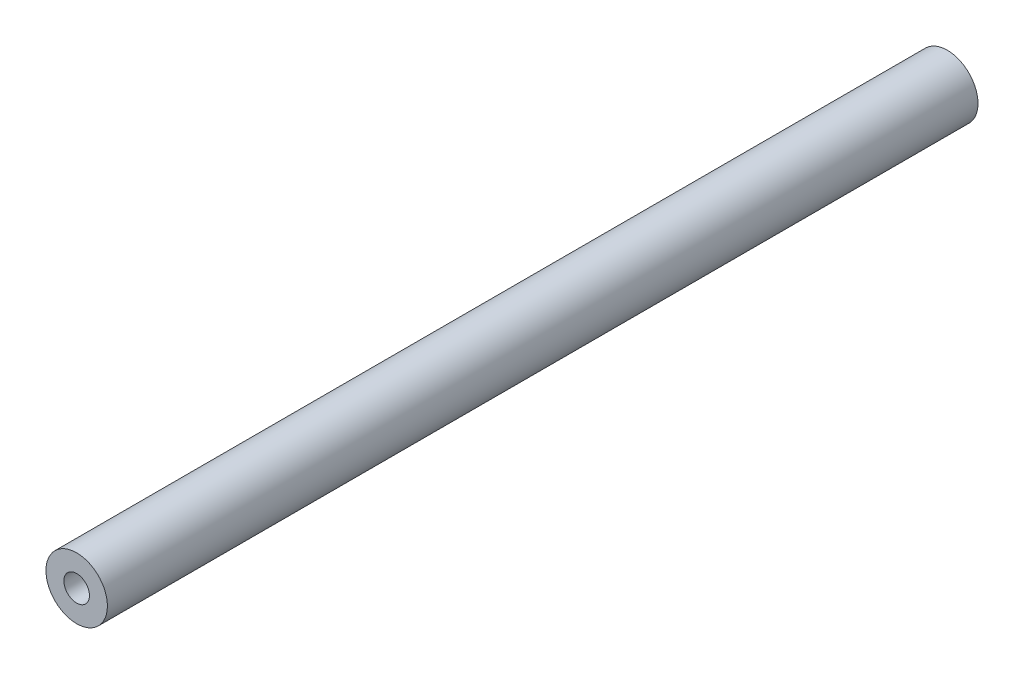
ISO-10303-21;
HEADER;
FILE_DESCRIPTION(('STEP AP214'),'2;1');
FILE_NAME('part.step','',(''),(''),'','','');
FILE_SCHEMA(('AUTOMOTIVE_DESIGN { 1 0 10303 214 1 1 1 1 }'));
ENDSEC;
DATA;
#1=APPLICATION_CONTEXT('core data for automotive mechanical design processes');
#2=APPLICATION_PROTOCOL_DEFINITION('international standard','automotive_design',2000,#1);
#3=PRODUCT_CONTEXT('',#1,'mechanical');
#4=PRODUCT('Part','Part','',(#3));
#5=PRODUCT_RELATED_PRODUCT_CATEGORY('part','',(#4));
#6=PRODUCT_DEFINITION_FORMATION('','',#4);
#7=PRODUCT_DEFINITION_CONTEXT('part definition',#1,'design');
#8=PRODUCT_DEFINITION('design','',#6,#7);
#9=PRODUCT_DEFINITION_SHAPE('','',#8);
#10=(LENGTH_UNIT() NAMED_UNIT(*) SI_UNIT(.MILLI.,.METRE.));
#11=(NAMED_UNIT(*) PLANE_ANGLE_UNIT() SI_UNIT($,.RADIAN.));
#12=(NAMED_UNIT(*) SI_UNIT($,.STERADIAN.) SOLID_ANGLE_UNIT());
#13=UNCERTAINTY_MEASURE_WITH_UNIT(LENGTH_MEASURE(1.E-05),#10,'distance_accuracy_value','');
#14=(GEOMETRIC_REPRESENTATION_CONTEXT(3) GLOBAL_UNCERTAINTY_ASSIGNED_CONTEXT((#13)) GLOBAL_UNIT_ASSIGNED_CONTEXT((#10,
#11,#12)) REPRESENTATION_CONTEXT('',''));
#15=CARTESIAN_POINT('',(0.,0.,0.));
#16=DIRECTION('',(0.,0.,1.));
#17=DIRECTION('',(1.,0.,0.));
#18=AXIS2_PLACEMENT_3D('',#15,#16,#17);
#19=CARTESIAN_POINT('',(0.,0.,85.));
#20=DIRECTION('',(0.,0.,-1.));
#21=DIRECTION('',(-1.,0.,0.));
#22=AXIS2_PLACEMENT_3D('',#19,#20,#21);
#23=CYLINDRICAL_SURFACE('',#22,3.);
#24=CARTESIAN_POINT('',(0.,0.,85.));
#25=DIRECTION('',(0.,0.,1.));
#26=DIRECTION('',(1.,0.,0.));
#27=AXIS2_PLACEMENT_3D('',#24,#25,#26);
#28=CIRCLE('',#27,3.);
#29=CARTESIAN_POINT('',(3.,0.,85.));
#30=VERTEX_POINT('',#29);
#31=EDGE_CURVE('E11',#30,#30,#28,.T.);
#32=ORIENTED_EDGE('',*,*,#31,.F.);
#33=EDGE_LOOP('',(#32));
#34=FACE_BOUND('',#33,.T.);
#35=CARTESIAN_POINT('',(0.,0.,0.));
#36=DIRECTION('',(0.,0.,1.));
#37=DIRECTION('',(1.,0.,0.));
#38=AXIS2_PLACEMENT_3D('',#35,#36,#37);
#39=CIRCLE('',#38,3.);
#40=CARTESIAN_POINT('',(3.,0.,0.));
#41=VERTEX_POINT('',#40);
#42=EDGE_CURVE('E41',#41,#41,#39,.T.);
#43=ORIENTED_EDGE('',*,*,#42,.T.);
#44=EDGE_LOOP('',(#43));
#45=FACE_BOUND('',#44,.T.);
#46=ADVANCED_FACE('F38',(#34,#45),#23,.T.);
#47=CARTESIAN_POINT('',(0.,0.,85.));
#48=DIRECTION('',(0.,0.,1.));
#49=DIRECTION('',(1.,0.,0.));
#50=AXIS2_PLACEMENT_3D('',#47,#48,#49);
#51=PLANE('',#50);
#52=CARTESIAN_POINT('',(0.,0.,85.));
#53=DIRECTION('',(0.,0.,1.));
#54=DIRECTION('',(1.,0.,0.));
#55=AXIS2_PLACEMENT_3D('',#52,#53,#54);
#56=CIRCLE('',#55,1.25);
#57=CARTESIAN_POINT('',(1.25,0.,85.));
#58=VERTEX_POINT('',#57);
#59=EDGE_CURVE('E63',#58,#58,#56,.T.);
#60=ORIENTED_EDGE('',*,*,#59,.F.);
#61=EDGE_LOOP('',(#60));
#62=FACE_BOUND('',#61,.T.);
#63=ORIENTED_EDGE('',*,*,#31,.T.);
#64=EDGE_LOOP('',(#63));
#65=FACE_BOUND('',#64,.T.);
#66=ADVANCED_FACE('F86',(#62,#65),#51,.T.);
#67=CARTESIAN_POINT('',(0.,0.,0.));
#68=DIRECTION('',(0.,0.,1.));
#69=DIRECTION('',(1.,0.,0.));
#70=AXIS2_PLACEMENT_3D('',#67,#68,#69);
#71=PLANE('',#70);
#72=CARTESIAN_POINT('',(0.,0.,0.));
#73=DIRECTION('',(0.,0.,-1.));
#74=DIRECTION('',(-1.,0.,0.));
#75=AXIS2_PLACEMENT_3D('',#72,#73,#74);
#76=CIRCLE('',#75,1.25);
#77=CARTESIAN_POINT('',(-1.25,0.,0.));
#78=VERTEX_POINT('',#77);
#79=EDGE_CURVE('E64',#78,#78,#76,.T.);
#80=ORIENTED_EDGE('',*,*,#79,.F.);
#81=EDGE_LOOP('',(#80));
#82=FACE_BOUND('',#81,.T.);
#83=ORIENTED_EDGE('',*,*,#42,.F.);
#84=EDGE_LOOP('',(#83));
#85=FACE_BOUND('',#84,.T.);
#86=ADVANCED_FACE('F83',(#82,#85),#71,.F.);
#87=CARTESIAN_POINT('',(0.,0.,77.));
#88=DIRECTION('',(0.,0.,1.));
#89=DIRECTION('',(1.,0.,0.));
#90=AXIS2_PLACEMENT_3D('',#87,#88,#89);
#91=CONICAL_SURFACE('',#90,1.25,1.02974425867665);
#92=CARTESIAN_POINT('',(0.,0.,76.2489242262155));
#93=VERTEX_POINT('',#92);
#94=VERTEX_LOOP('',#93);
#95=FACE_BOUND('',#94,.T.);
#96=CARTESIAN_POINT('',(0.,0.,77.));
#97=DIRECTION('',(0.,0.,1.));
#98=DIRECTION('',(1.,0.,0.));
#99=AXIS2_PLACEMENT_3D('',#96,#97,#98);
#100=CIRCLE('',#99,1.25);
#101=CARTESIAN_POINT('',(1.25,0.,77.));
#102=VERTEX_POINT('',#101);
#103=EDGE_CURVE('E69',#102,#102,#100,.T.);
#104=ORIENTED_EDGE('',*,*,#103,.T.);
#105=EDGE_LOOP('',(#104));
#106=FACE_BOUND('',#105,.T.);
#107=ADVANCED_FACE('F85',(#95,#106),#91,.F.);
#108=CARTESIAN_POINT('',(0.,0.,85.));
#109=DIRECTION('',(0.,0.,1.));
#110=DIRECTION('',(1.,0.,0.));
#111=AXIS2_PLACEMENT_3D('',#108,#109,#110);
#112=CYLINDRICAL_SURFACE('',#111,1.25);
#113=ORIENTED_EDGE('',*,*,#103,.F.);
#114=EDGE_LOOP('',(#113));
#115=FACE_BOUND('',#114,.T.);
#116=ORIENTED_EDGE('',*,*,#59,.T.);
#117=EDGE_LOOP('',(#116));
#118=FACE_BOUND('',#117,.T.);
#119=ADVANCED_FACE('F56',(#115,#118),#112,.F.);
#120=CARTESIAN_POINT('',(0.,0.,8.));
#121=DIRECTION('',(0.,0.,-1.));
#122=DIRECTION('',(-1.,0.,0.));
#123=AXIS2_PLACEMENT_3D('',#120,#121,#122);
#124=CONICAL_SURFACE('',#123,1.25,1.02974425867665);
#125=CARTESIAN_POINT('',(0.,0.,8.75107577378445));
#126=VERTEX_POINT('',#125);
#127=VERTEX_LOOP('',#126);
#128=FACE_BOUND('',#127,.T.);
#129=CARTESIAN_POINT('',(0.,0.,8.));
#130=DIRECTION('',(0.,0.,-1.));
#131=DIRECTION('',(-1.,0.,0.));
#132=AXIS2_PLACEMENT_3D('',#129,#130,#131);
#133=CIRCLE('',#132,1.25);
#134=CARTESIAN_POINT('',(-1.25,0.,8.));
#135=VERTEX_POINT('',#134);
#136=EDGE_CURVE('E60',#135,#135,#133,.T.);
#137=ORIENTED_EDGE('',*,*,#136,.T.);
#138=EDGE_LOOP('',(#137));
#139=FACE_BOUND('',#138,.T.);
#140=ADVANCED_FACE('F52',(#128,#139),#124,.F.);
#141=CARTESIAN_POINT('',(0.,0.,0.));
#142=DIRECTION('',(0.,0.,-1.));
#143=DIRECTION('',(-1.,0.,0.));
#144=AXIS2_PLACEMENT_3D('',#141,#142,#143);
#145=CYLINDRICAL_SURFACE('',#144,1.25);
#146=ORIENTED_EDGE('',*,*,#136,.F.);
#147=EDGE_LOOP('',(#146));
#148=FACE_BOUND('',#147,.T.);
#149=ORIENTED_EDGE('',*,*,#79,.T.);
#150=EDGE_LOOP('',(#149));
#151=FACE_BOUND('',#150,.T.);
#152=ADVANCED_FACE('F55',(#148,#151),#145,.F.);
#153=CLOSED_SHELL('',(#46,#66,#86,#107,#119,#140,#152));
#154=MANIFOLD_SOLID_BREP('B2',#153);
#155=ADVANCED_BREP_SHAPE_REPRESENTATION('',(#18,#154),#14);
#156=SHAPE_DEFINITION_REPRESENTATION(#9,#155);
ENDSEC;
END-ISO-10303-21;
